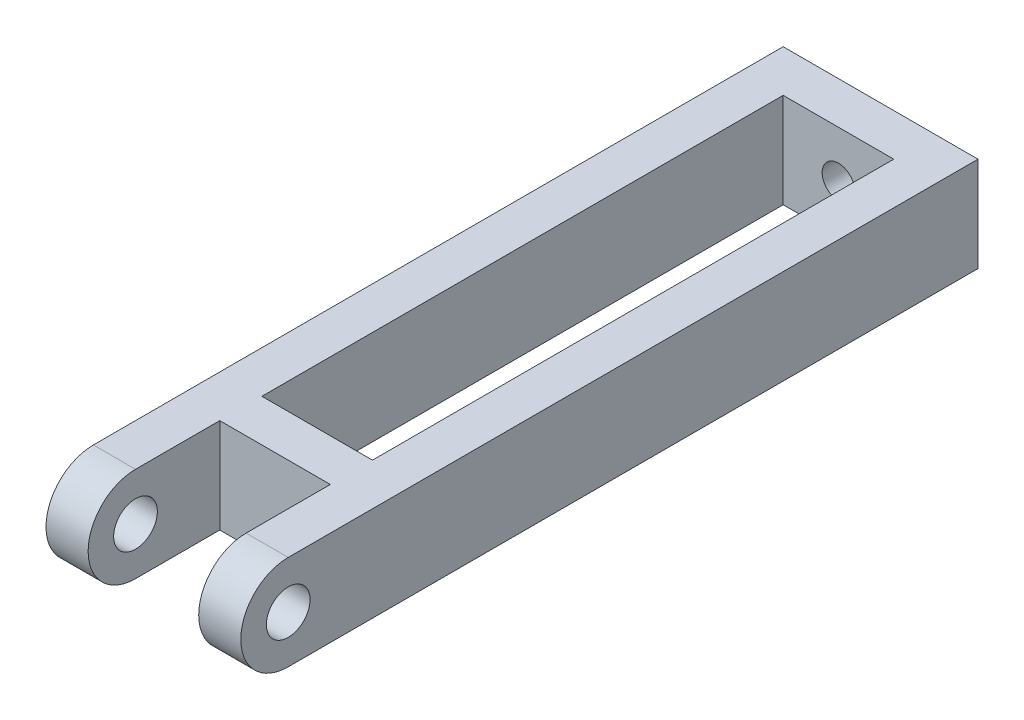
ISO-10303-21;
HEADER;
FILE_DESCRIPTION(('STEP AP214'),'2;1');
FILE_NAME('part.step','',(''),(''),'','','');
FILE_SCHEMA(('AUTOMOTIVE_DESIGN { 1 0 10303 214 1 1 1 1 }'));
ENDSEC;
DATA;
#1=APPLICATION_CONTEXT('core data for automotive mechanical design processes');
#2=APPLICATION_PROTOCOL_DEFINITION('international standard','automotive_design',2000,#1);
#3=PRODUCT_CONTEXT('',#1,'mechanical');
#4=PRODUCT('Part','Part','',(#3));
#5=PRODUCT_RELATED_PRODUCT_CATEGORY('part','',(#4));
#6=PRODUCT_DEFINITION_FORMATION('','',#4);
#7=PRODUCT_DEFINITION_CONTEXT('part definition',#1,'design');
#8=PRODUCT_DEFINITION('design','',#6,#7);
#9=PRODUCT_DEFINITION_SHAPE('','',#8);
#10=(LENGTH_UNIT() NAMED_UNIT(*) SI_UNIT(.MILLI.,.METRE.));
#11=(NAMED_UNIT(*) PLANE_ANGLE_UNIT() SI_UNIT($,.RADIAN.));
#12=(NAMED_UNIT(*) SI_UNIT($,.STERADIAN.) SOLID_ANGLE_UNIT());
#13=UNCERTAINTY_MEASURE_WITH_UNIT(LENGTH_MEASURE(1.E-05),#10,'distance_accuracy_value','');
#14=(GEOMETRIC_REPRESENTATION_CONTEXT(3) GLOBAL_UNCERTAINTY_ASSIGNED_CONTEXT((#13)) GLOBAL_UNIT_ASSIGNED_CONTEXT((#10,
#11,#12)) REPRESENTATION_CONTEXT('',''));
#15=CARTESIAN_POINT('',(0.,0.,0.));
#16=DIRECTION('',(0.,0.,1.));
#17=DIRECTION('',(1.,0.,0.));
#18=AXIS2_PLACEMENT_3D('',#15,#16,#17);
#19=CARTESIAN_POINT('',(-4.,4.5,0.));
#20=DIRECTION('',(0.,1.,0.));
#21=DIRECTION('',(0.,0.,1.));
#22=AXIS2_PLACEMENT_3D('',#19,#20,#21);
#23=PLANE('',#22);
#24=DIRECTION('',(0.,0.,1.));
#25=VECTOR('',#24,1.);
#26=CARTESIAN_POINT('',(0.,4.5,0.));
#27=LINE('',#26,#25);
#28=CARTESIAN_POINT('',(0.,4.5,-8.));
#29=VERTEX_POINT('',#28);
#30=CARTESIAN_POINT('',(0.,4.5,0.));
#31=VERTEX_POINT('',#30);
#32=EDGE_CURVE('E160',#29,#31,#27,.T.);
#33=ORIENTED_EDGE('',*,*,#32,.F.);
#34=DIRECTION('',(-1.,0.,0.));
#35=VECTOR('',#34,1.);
#36=CARTESIAN_POINT('',(5.25,4.5,-8.));
#37=LINE('',#36,#35);
#38=CARTESIAN_POINT('',(10.5,4.5,-8.));
#39=VERTEX_POINT('',#38);
#40=EDGE_CURVE('E187',#39,#29,#37,.T.);
#41=ORIENTED_EDGE('',*,*,#40,.F.);
#42=DIRECTION('',(0.,0.,1.));
#43=VECTOR('',#42,1.);
#44=CARTESIAN_POINT('',(10.5,4.5,0.));
#45=LINE('',#44,#43);
#46=CARTESIAN_POINT('',(10.5,4.5,0.));
#47=VERTEX_POINT('',#46);
#48=EDGE_CURVE('E200',#39,#47,#45,.T.);
#49=ORIENTED_EDGE('',*,*,#48,.T.);
#50=DIRECTION('',(-1.,0.,0.));
#51=VECTOR('',#50,1.);
#52=CARTESIAN_POINT('',(14.5,4.5,0.));
#53=LINE('',#52,#51);
#54=CARTESIAN_POINT('',(14.5,4.5,0.));
#55=VERTEX_POINT('',#54);
#56=EDGE_CURVE('E193',#55,#47,#53,.T.);
#57=ORIENTED_EDGE('',*,*,#56,.F.);
#58=DIRECTION('',(0.,0.,1.));
#59=VECTOR('',#58,1.);
#60=CARTESIAN_POINT('',(14.5,4.5,0.));
#61=LINE('',#60,#59);
#62=CARTESIAN_POINT('',(14.5,4.5,-65.5));
#63=VERTEX_POINT('',#62);
#64=EDGE_CURVE('E197',#63,#55,#61,.T.);
#65=ORIENTED_EDGE('',*,*,#64,.F.);
#66=DIRECTION('',(1.,0.,0.));
#67=VECTOR('',#66,1.);
#68=CARTESIAN_POINT('',(-4.,4.5,-65.5));
#69=LINE('',#68,#67);
#70=CARTESIAN_POINT('',(-4.,4.5,-65.5));
#71=VERTEX_POINT('',#70);
#72=EDGE_CURVE('E156',#71,#63,#69,.T.);
#73=ORIENTED_EDGE('',*,*,#72,.F.);
#74=DIRECTION('',(0.,0.,1.));
#75=VECTOR('',#74,1.);
#76=CARTESIAN_POINT('',(-4.,4.5,0.));
#77=LINE('',#76,#75);
#78=CARTESIAN_POINT('',(-4.,4.5,0.));
#79=VERTEX_POINT('',#78);
#80=EDGE_CURVE('E154',#71,#79,#77,.T.);
#81=ORIENTED_EDGE('',*,*,#80,.T.);
#82=DIRECTION('',(1.,0.,0.));
#83=VECTOR('',#82,1.);
#84=CARTESIAN_POINT('',(-4.,4.5,0.));
#85=LINE('',#84,#83);
#86=EDGE_CURVE('E135',#79,#31,#85,.T.);
#87=ORIENTED_EDGE('',*,*,#86,.T.);
#88=EDGE_LOOP('',(#33,#41,#49,#57,#65,#73,#81,#87));
#89=FACE_BOUND('',#88,.T.);
#90=DIRECTION('',(-1.,0.,0.));
#91=VECTOR('',#90,1.);
#92=CARTESIAN_POINT('',(-4.,4.5,-12.));
#93=LINE('',#92,#91);
#94=CARTESIAN_POINT('',(10.5,4.5,-12.));
#95=VERTEX_POINT('',#94);
#96=CARTESIAN_POINT('',(0.,4.5,-12.));
#97=VERTEX_POINT('',#96);
#98=EDGE_CURVE('E230',#95,#97,#93,.T.);
#99=ORIENTED_EDGE('',*,*,#98,.T.);
#100=DIRECTION('',(0.,0.,-1.));
#101=VECTOR('',#100,1.);
#102=CARTESIAN_POINT('',(0.,4.5,0.));
#103=LINE('',#102,#101);
#104=CARTESIAN_POINT('',(0.,4.5,-61.5));
#105=VERTEX_POINT('',#104);
#106=EDGE_CURVE('E227',#97,#105,#103,.T.);
#107=ORIENTED_EDGE('',*,*,#106,.T.);
#108=DIRECTION('',(1.,0.,0.));
#109=VECTOR('',#108,1.);
#110=CARTESIAN_POINT('',(-4.,4.5,-61.5));
#111=LINE('',#110,#109);
#112=CARTESIAN_POINT('',(10.5,4.5,-61.5));
#113=VERTEX_POINT('',#112);
#114=EDGE_CURVE('E234',#105,#113,#111,.T.);
#115=ORIENTED_EDGE('',*,*,#114,.T.);
#116=DIRECTION('',(0.,0.,1.));
#117=VECTOR('',#116,1.);
#118=CARTESIAN_POINT('',(10.5,4.5,0.));
#119=LINE('',#118,#117);
#120=EDGE_CURVE('E142',#113,#95,#119,.T.);
#121=ORIENTED_EDGE('',*,*,#120,.T.);
#122=EDGE_LOOP('',(#99,#107,#115,#121));
#123=FACE_BOUND('',#122,.T.);
#124=ADVANCED_FACE('F43',(#89,#123),#23,.T.);
#125=CARTESIAN_POINT('',(-4.,-4.5,0.));
#126=DIRECTION('',(0.,-1.,0.));
#127=DIRECTION('',(0.,0.,-1.));
#128=AXIS2_PLACEMENT_3D('',#125,#126,#127);
#129=PLANE('',#128);
#130=DIRECTION('',(0.,0.,-1.));
#131=VECTOR('',#130,1.);
#132=CARTESIAN_POINT('',(0.,-4.5,0.));
#133=LINE('',#132,#131);
#134=CARTESIAN_POINT('',(0.,-4.5,0.));
#135=VERTEX_POINT('',#134);
#136=CARTESIAN_POINT('',(0.,-4.5,-8.));
#137=VERTEX_POINT('',#136);
#138=EDGE_CURVE('E163',#135,#137,#133,.T.);
#139=ORIENTED_EDGE('',*,*,#138,.F.);
#140=DIRECTION('',(1.,0.,0.));
#141=VECTOR('',#140,1.);
#142=CARTESIAN_POINT('',(-4.,-4.5,0.));
#143=LINE('',#142,#141);
#144=CARTESIAN_POINT('',(-4.,-4.5,0.));
#145=VERTEX_POINT('',#144);
#146=EDGE_CURVE('E151',#145,#135,#143,.T.);
#147=ORIENTED_EDGE('',*,*,#146,.F.);
#148=DIRECTION('',(0.,0.,-1.));
#149=VECTOR('',#148,1.);
#150=CARTESIAN_POINT('',(-4.,-4.5,0.));
#151=LINE('',#150,#149);
#152=CARTESIAN_POINT('',(-4.,-4.5,-65.5));
#153=VERTEX_POINT('',#152);
#154=EDGE_CURVE('E174',#145,#153,#151,.T.);
#155=ORIENTED_EDGE('',*,*,#154,.T.);
#156=DIRECTION('',(1.,0.,0.));
#157=VECTOR('',#156,1.);
#158=CARTESIAN_POINT('',(-4.,-4.5,-65.5));
#159=LINE('',#158,#157);
#160=CARTESIAN_POINT('',(14.5,-4.5,-65.5));
#161=VERTEX_POINT('',#160);
#162=EDGE_CURVE('E153',#153,#161,#159,.T.);
#163=ORIENTED_EDGE('',*,*,#162,.T.);
#164=DIRECTION('',(0.,0.,-1.));
#165=VECTOR('',#164,1.);
#166=CARTESIAN_POINT('',(14.5,-4.5,0.));
#167=LINE('',#166,#165);
#168=CARTESIAN_POINT('',(14.5,-4.5,0.));
#169=VERTEX_POINT('',#168);
#170=EDGE_CURVE('E214',#169,#161,#167,.T.);
#171=ORIENTED_EDGE('',*,*,#170,.F.);
#172=DIRECTION('',(-1.,0.,0.));
#173=VECTOR('',#172,1.);
#174=CARTESIAN_POINT('',(14.5,-4.5,0.));
#175=LINE('',#174,#173);
#176=CARTESIAN_POINT('',(10.5,-4.5,0.));
#177=VERTEX_POINT('',#176);
#178=EDGE_CURVE('E194',#169,#177,#175,.T.);
#179=ORIENTED_EDGE('',*,*,#178,.T.);
#180=DIRECTION('',(0.,0.,-1.));
#181=VECTOR('',#180,1.);
#182=CARTESIAN_POINT('',(10.5,-4.5,0.));
#183=LINE('',#182,#181);
#184=CARTESIAN_POINT('',(10.5,-4.5,-8.));
#185=VERTEX_POINT('',#184);
#186=EDGE_CURVE('E203',#177,#185,#183,.T.);
#187=ORIENTED_EDGE('',*,*,#186,.T.);
#188=DIRECTION('',(-1.,0.,0.));
#189=VECTOR('',#188,1.);
#190=CARTESIAN_POINT('',(5.25,-4.5,-8.));
#191=LINE('',#190,#189);
#192=EDGE_CURVE('E182',#185,#137,#191,.T.);
#193=ORIENTED_EDGE('',*,*,#192,.T.);
#194=EDGE_LOOP('',(#139,#147,#155,#163,#171,#179,#187,#193));
#195=FACE_BOUND('',#194,.T.);
#196=DIRECTION('',(-1.,0.,0.));
#197=VECTOR('',#196,1.);
#198=CARTESIAN_POINT('',(-4.,-4.5,-61.5));
#199=LINE('',#198,#197);
#200=CARTESIAN_POINT('',(10.5,-4.5,-61.5));
#201=VERTEX_POINT('',#200);
#202=CARTESIAN_POINT('',(0.,-4.5,-61.5));
#203=VERTEX_POINT('',#202);
#204=EDGE_CURVE('E130',#201,#203,#199,.T.);
#205=ORIENTED_EDGE('',*,*,#204,.T.);
#206=DIRECTION('',(0.,0.,1.));
#207=VECTOR('',#206,1.);
#208=CARTESIAN_POINT('',(0.,-4.5,0.));
#209=LINE('',#208,#207);
#210=CARTESIAN_POINT('',(0.,-4.5,-12.));
#211=VERTEX_POINT('',#210);
#212=EDGE_CURVE('E11',#203,#211,#209,.T.);
#213=ORIENTED_EDGE('',*,*,#212,.T.);
#214=DIRECTION('',(1.,0.,0.));
#215=VECTOR('',#214,1.);
#216=CARTESIAN_POINT('',(-4.,-4.5,-12.));
#217=LINE('',#216,#215);
#218=CARTESIAN_POINT('',(10.5,-4.5,-12.));
#219=VERTEX_POINT('',#218);
#220=EDGE_CURVE('E52',#211,#219,#217,.T.);
#221=ORIENTED_EDGE('',*,*,#220,.T.);
#222=DIRECTION('',(0.,0.,-1.));
#223=VECTOR('',#222,1.);
#224=CARTESIAN_POINT('',(10.5,-4.5,0.));
#225=LINE('',#224,#223);
#226=EDGE_CURVE('E134',#219,#201,#225,.T.);
#227=ORIENTED_EDGE('',*,*,#226,.T.);
#228=EDGE_LOOP('',(#205,#213,#221,#227));
#229=FACE_BOUND('',#228,.T.);
#230=ADVANCED_FACE('F147',(#195,#229),#129,.T.);
#231=CARTESIAN_POINT('',(-4.,0.,0.));
#232=DIRECTION('',(1.,0.,0.));
#233=DIRECTION('',(0.,0.,-1.));
#234=AXIS2_PLACEMENT_3D('',#231,#232,#233);
#235=CYLINDRICAL_SURFACE('',#234,4.5);
#236=CARTESIAN_POINT('',(0.,0.,0.));
#237=DIRECTION('',(1.,0.,0.));
#238=DIRECTION('',(0.,0.,-1.));
#239=AXIS2_PLACEMENT_3D('',#236,#237,#238);
#240=CIRCLE('',#239,4.5);
#241=EDGE_CURVE('E165',#31,#135,#240,.T.);
#242=ORIENTED_EDGE('',*,*,#241,.F.);
#243=ORIENTED_EDGE('',*,*,#86,.F.);
#244=CARTESIAN_POINT('',(-4.,0.,0.));
#245=DIRECTION('',(1.,0.,0.));
#246=DIRECTION('',(0.,0.,-1.));
#247=AXIS2_PLACEMENT_3D('',#244,#245,#246);
#248=CIRCLE('',#247,4.5);
#249=EDGE_CURVE('E162',#79,#145,#248,.T.);
#250=ORIENTED_EDGE('',*,*,#249,.T.);
#251=ORIENTED_EDGE('',*,*,#146,.T.);
#252=EDGE_LOOP('',(#242,#243,#250,#251));
#253=FACE_BOUND('',#252,.T.);
#254=ADVANCED_FACE('F45',(#253),#235,.T.);
#255=CARTESIAN_POINT('',(-4.,4.5,-65.5));
#256=DIRECTION('',(0.,0.,-1.));
#257=DIRECTION('',(-1.,0.,0.));
#258=AXIS2_PLACEMENT_3D('',#255,#256,#257);
#259=PLANE('',#258);
#260=CARTESIAN_POINT('',(5.25,0.,-65.5));
#261=DIRECTION('',(0.,0.,-1.));
#262=DIRECTION('',(-1.,0.,0.));
#263=AXIS2_PLACEMENT_3D('',#260,#261,#262);
#264=CIRCLE('',#263,1.55);
#265=CARTESIAN_POINT('',(3.7,0.,-65.5));
#266=VERTEX_POINT('',#265);
#267=EDGE_CURVE('E241',#266,#266,#264,.T.);
#268=ORIENTED_EDGE('',*,*,#267,.F.);
#269=EDGE_LOOP('',(#268));
#270=FACE_BOUND('',#269,.T.);
#271=ORIENTED_EDGE('',*,*,#72,.T.);
#272=DIRECTION('',(0.,1.,0.));
#273=VECTOR('',#272,1.);
#274=CARTESIAN_POINT('',(14.5,4.5,-65.5));
#275=LINE('',#274,#273);
#276=EDGE_CURVE('E211',#161,#63,#275,.T.);
#277=ORIENTED_EDGE('',*,*,#276,.F.);
#278=ORIENTED_EDGE('',*,*,#162,.F.);
#279=DIRECTION('',(0.,1.,0.));
#280=VECTOR('',#279,1.);
#281=CARTESIAN_POINT('',(-4.,4.5,-65.5));
#282=LINE('',#281,#280);
#283=EDGE_CURVE('E171',#153,#71,#282,.T.);
#284=ORIENTED_EDGE('',*,*,#283,.T.);
#285=EDGE_LOOP('',(#271,#277,#278,#284));
#286=FACE_BOUND('',#285,.T.);
#287=ADVANCED_FACE('F274',(#270,#286),#259,.T.);
#288=CARTESIAN_POINT('',(-4.,0.,0.));
#289=DIRECTION('',(1.,0.,0.));
#290=DIRECTION('',(0.,0.,-1.));
#291=AXIS2_PLACEMENT_3D('',#288,#289,#290);
#292=PLANE('',#291);
#293=CARTESIAN_POINT('',(-4.,0.,0.));
#294=DIRECTION('',(1.,0.,0.));
#295=DIRECTION('',(0.,0.,-1.));
#296=AXIS2_PLACEMENT_3D('',#293,#294,#295);
#297=CIRCLE('',#296,2.075);
#298=CARTESIAN_POINT('',(-4.,0.,-2.075));
#299=VERTEX_POINT('',#298);
#300=EDGE_CURVE('E168',#299,#299,#297,.T.);
#301=ORIENTED_EDGE('',*,*,#300,.T.);
#302=EDGE_LOOP('',(#301));
#303=FACE_BOUND('',#302,.T.);
#304=ORIENTED_EDGE('',*,*,#249,.F.);
#305=ORIENTED_EDGE('',*,*,#80,.F.);
#306=ORIENTED_EDGE('',*,*,#283,.F.);
#307=ORIENTED_EDGE('',*,*,#154,.F.);
#308=EDGE_LOOP('',(#304,#305,#306,#307));
#309=FACE_BOUND('',#308,.T.);
#310=ADVANCED_FACE('F275',(#303,#309),#292,.F.);
#311=CARTESIAN_POINT('',(0.,0.,0.));
#312=DIRECTION('',(1.,0.,0.));
#313=DIRECTION('',(0.,0.,-1.));
#314=AXIS2_PLACEMENT_3D('',#311,#312,#313);
#315=PLANE('',#314);
#316=DIRECTION('',(0.,-1.,0.));
#317=VECTOR('',#316,1.);
#318=CARTESIAN_POINT('',(0.,4.5,-8.));
#319=LINE('',#318,#317);
#320=EDGE_CURVE('E190',#29,#137,#319,.T.);
#321=ORIENTED_EDGE('',*,*,#320,.F.);
#322=ORIENTED_EDGE('',*,*,#32,.T.);
#323=ORIENTED_EDGE('',*,*,#241,.T.);
#324=ORIENTED_EDGE('',*,*,#138,.T.);
#325=EDGE_LOOP('',(#321,#322,#323,#324));
#326=FACE_BOUND('',#325,.T.);
#327=CARTESIAN_POINT('',(0.,0.,0.));
#328=DIRECTION('',(1.,0.,0.));
#329=DIRECTION('',(0.,0.,-1.));
#330=AXIS2_PLACEMENT_3D('',#327,#328,#329);
#331=CIRCLE('',#330,2.075);
#332=CARTESIAN_POINT('',(0.,0.,-2.075));
#333=VERTEX_POINT('',#332);
#334=EDGE_CURVE('E179',#333,#333,#331,.T.);
#335=ORIENTED_EDGE('',*,*,#334,.F.);
#336=EDGE_LOOP('',(#335));
#337=FACE_BOUND('',#336,.T.);
#338=ADVANCED_FACE('F272',(#326,#337),#315,.T.);
#339=CARTESIAN_POINT('',(-4.,0.,0.));
#340=DIRECTION('',(1.,0.,0.));
#341=DIRECTION('',(0.,0.,-1.));
#342=AXIS2_PLACEMENT_3D('',#339,#340,#341);
#343=CYLINDRICAL_SURFACE('',#342,2.075);
#344=ORIENTED_EDGE('',*,*,#300,.F.);
#345=EDGE_LOOP('',(#344));
#346=FACE_BOUND('',#345,.T.);
#347=ORIENTED_EDGE('',*,*,#334,.T.);
#348=EDGE_LOOP('',(#347));
#349=FACE_BOUND('',#348,.T.);
#350=ADVANCED_FACE('F332',(#346,#349),#343,.F.);
#351=CARTESIAN_POINT('',(5.25,4.5,-8.));
#352=DIRECTION('',(0.,0.,-1.));
#353=DIRECTION('',(0.,1.,0.));
#354=AXIS2_PLACEMENT_3D('',#351,#352,#353);
#355=PLANE('',#354);
#356=ORIENTED_EDGE('',*,*,#320,.T.);
#357=ORIENTED_EDGE('',*,*,#192,.F.);
#358=DIRECTION('',(0.,-1.,0.));
#359=VECTOR('',#358,1.);
#360=CARTESIAN_POINT('',(10.5,4.5,-8.));
#361=LINE('',#360,#359);
#362=EDGE_CURVE('E222',#39,#185,#361,.T.);
#363=ORIENTED_EDGE('',*,*,#362,.F.);
#364=ORIENTED_EDGE('',*,*,#40,.T.);
#365=EDGE_LOOP('',(#356,#357,#363,#364));
#366=FACE_BOUND('',#365,.T.);
#367=ADVANCED_FACE('F305',(#366),#355,.F.);
#368=CARTESIAN_POINT('',(14.5,0.,0.));
#369=DIRECTION('',(-1.,0.,0.));
#370=DIRECTION('',(0.,0.,-1.));
#371=AXIS2_PLACEMENT_3D('',#368,#369,#370);
#372=CYLINDRICAL_SURFACE('',#371,4.5);
#373=CARTESIAN_POINT('',(10.5,0.,0.));
#374=DIRECTION('',(1.,0.,0.));
#375=DIRECTION('',(0.,0.,-1.));
#376=AXIS2_PLACEMENT_3D('',#373,#374,#375);
#377=CIRCLE('',#376,4.5);
#378=EDGE_CURVE('E206',#47,#177,#377,.T.);
#379=ORIENTED_EDGE('',*,*,#378,.T.);
#380=ORIENTED_EDGE('',*,*,#178,.F.);
#381=CARTESIAN_POINT('',(14.5,0.,0.));
#382=DIRECTION('',(1.,0.,0.));
#383=DIRECTION('',(0.,0.,-1.));
#384=AXIS2_PLACEMENT_3D('',#381,#382,#383);
#385=CIRCLE('',#384,4.5);
#386=EDGE_CURVE('E202',#55,#169,#385,.T.);
#387=ORIENTED_EDGE('',*,*,#386,.F.);
#388=ORIENTED_EDGE('',*,*,#56,.T.);
#389=EDGE_LOOP('',(#379,#380,#387,#388));
#390=FACE_BOUND('',#389,.T.);
#391=ADVANCED_FACE('F296',(#390),#372,.T.);
#392=CARTESIAN_POINT('',(14.5,0.,0.));
#393=DIRECTION('',(-1.,0.,0.));
#394=DIRECTION('',(0.,0.,-1.));
#395=AXIS2_PLACEMENT_3D('',#392,#393,#394);
#396=PLANE('',#395);
#397=CARTESIAN_POINT('',(14.5,0.,0.));
#398=DIRECTION('',(1.,0.,0.));
#399=DIRECTION('',(0.,0.,-1.));
#400=AXIS2_PLACEMENT_3D('',#397,#398,#399);
#401=CIRCLE('',#400,2.075);
#402=CARTESIAN_POINT('',(14.5,0.,-2.075));
#403=VERTEX_POINT('',#402);
#404=EDGE_CURVE('E209',#403,#403,#401,.T.);
#405=ORIENTED_EDGE('',*,*,#404,.F.);
#406=EDGE_LOOP('',(#405));
#407=FACE_BOUND('',#406,.T.);
#408=ORIENTED_EDGE('',*,*,#386,.T.);
#409=ORIENTED_EDGE('',*,*,#170,.T.);
#410=ORIENTED_EDGE('',*,*,#276,.T.);
#411=ORIENTED_EDGE('',*,*,#64,.T.);
#412=EDGE_LOOP('',(#408,#409,#410,#411));
#413=FACE_BOUND('',#412,.T.);
#414=ADVANCED_FACE('F289',(#407,#413),#396,.F.);
#415=CARTESIAN_POINT('',(10.5,0.,0.));
#416=DIRECTION('',(-1.,0.,0.));
#417=DIRECTION('',(0.,0.,-1.));
#418=AXIS2_PLACEMENT_3D('',#415,#416,#417);
#419=PLANE('',#418);
#420=ORIENTED_EDGE('',*,*,#362,.T.);
#421=ORIENTED_EDGE('',*,*,#186,.F.);
#422=ORIENTED_EDGE('',*,*,#378,.F.);
#423=ORIENTED_EDGE('',*,*,#48,.F.);
#424=EDGE_LOOP('',(#420,#421,#422,#423));
#425=FACE_BOUND('',#424,.T.);
#426=CARTESIAN_POINT('',(10.5,0.,0.));
#427=DIRECTION('',(1.,0.,0.));
#428=DIRECTION('',(0.,0.,-1.));
#429=AXIS2_PLACEMENT_3D('',#426,#427,#428);
#430=CIRCLE('',#429,2.075);
#431=CARTESIAN_POINT('',(10.5,0.,-2.075));
#432=VERTEX_POINT('',#431);
#433=EDGE_CURVE('E219',#432,#432,#430,.T.);
#434=ORIENTED_EDGE('',*,*,#433,.T.);
#435=EDGE_LOOP('',(#434));
#436=FACE_BOUND('',#435,.T.);
#437=ADVANCED_FACE('F308',(#425,#436),#419,.T.);
#438=CARTESIAN_POINT('',(14.5,0.,0.));
#439=DIRECTION('',(-1.,0.,0.));
#440=DIRECTION('',(0.,0.,-1.));
#441=AXIS2_PLACEMENT_3D('',#438,#439,#440);
#442=CYLINDRICAL_SURFACE('',#441,2.075);
#443=ORIENTED_EDGE('',*,*,#404,.T.);
#444=EDGE_LOOP('',(#443));
#445=FACE_BOUND('',#444,.T.);
#446=ORIENTED_EDGE('',*,*,#433,.F.);
#447=EDGE_LOOP('',(#446));
#448=FACE_BOUND('',#447,.T.);
#449=ADVANCED_FACE('F311',(#445,#448),#442,.F.);
#450=CARTESIAN_POINT('',(0.,11.,-12.));
#451=DIRECTION('',(1.,0.,0.));
#452=DIRECTION('',(0.,0.,-1.));
#453=AXIS2_PLACEMENT_3D('',#450,#451,#452);
#454=PLANE('',#453);
#455=DIRECTION('',(0.,-1.,0.));
#456=VECTOR('',#455,1.);
#457=CARTESIAN_POINT('',(0.,11.,-12.));
#458=LINE('',#457,#456);
#459=EDGE_CURVE('E236',#97,#211,#458,.T.);
#460=ORIENTED_EDGE('',*,*,#459,.T.);
#461=ORIENTED_EDGE('',*,*,#212,.F.);
#462=DIRECTION('',(0.,-1.,0.));
#463=VECTOR('',#462,1.);
#464=CARTESIAN_POINT('',(0.,11.,-61.5));
#465=LINE('',#464,#463);
#466=EDGE_CURVE('E64',#105,#203,#465,.T.);
#467=ORIENTED_EDGE('',*,*,#466,.F.);
#468=ORIENTED_EDGE('',*,*,#106,.F.);
#469=EDGE_LOOP('',(#460,#461,#467,#468));
#470=FACE_BOUND('',#469,.T.);
#471=ADVANCED_FACE('F315',(#470),#454,.T.);
#472=CARTESIAN_POINT('',(0.,11.,-12.));
#473=DIRECTION('',(0.,0.,-1.));
#474=DIRECTION('',(-1.,0.,0.));
#475=AXIS2_PLACEMENT_3D('',#472,#473,#474);
#476=PLANE('',#475);
#477=DIRECTION('',(0.,-1.,0.));
#478=VECTOR('',#477,1.);
#479=CARTESIAN_POINT('',(10.5,11.,-12.));
#480=LINE('',#479,#478);
#481=EDGE_CURVE('E144',#95,#219,#480,.T.);
#482=ORIENTED_EDGE('',*,*,#481,.T.);
#483=ORIENTED_EDGE('',*,*,#220,.F.);
#484=ORIENTED_EDGE('',*,*,#459,.F.);
#485=ORIENTED_EDGE('',*,*,#98,.F.);
#486=EDGE_LOOP('',(#482,#483,#484,#485));
#487=FACE_BOUND('',#486,.T.);
#488=ADVANCED_FACE('F258',(#487),#476,.T.);
#489=CARTESIAN_POINT('',(10.5,11.,-12.));
#490=DIRECTION('',(-1.,0.,0.));
#491=DIRECTION('',(0.,0.,1.));
#492=AXIS2_PLACEMENT_3D('',#489,#490,#491);
#493=PLANE('',#492);
#494=DIRECTION('',(0.,-1.,0.));
#495=VECTOR('',#494,1.);
#496=CARTESIAN_POINT('',(10.5,11.,-61.5));
#497=LINE('',#496,#495);
#498=EDGE_CURVE('E59',#113,#201,#497,.T.);
#499=ORIENTED_EDGE('',*,*,#498,.T.);
#500=ORIENTED_EDGE('',*,*,#226,.F.);
#501=ORIENTED_EDGE('',*,*,#481,.F.);
#502=ORIENTED_EDGE('',*,*,#120,.F.);
#503=EDGE_LOOP('',(#499,#500,#501,#502));
#504=FACE_BOUND('',#503,.T.);
#505=ADVANCED_FACE('F138',(#504),#493,.T.);
#506=CARTESIAN_POINT('',(0.,11.,-61.5));
#507=DIRECTION('',(0.,0.,1.));
#508=DIRECTION('',(1.,0.,0.));
#509=AXIS2_PLACEMENT_3D('',#506,#507,#508);
#510=PLANE('',#509);
#511=CARTESIAN_POINT('',(5.25,0.,-61.5));
#512=DIRECTION('',(0.,0.,1.));
#513=DIRECTION('',(1.,0.,0.));
#514=AXIS2_PLACEMENT_3D('',#511,#512,#513);
#515=CIRCLE('',#514,1.55);
#516=CARTESIAN_POINT('',(6.8,0.,-61.5));
#517=VERTEX_POINT('',#516);
#518=EDGE_CURVE('E47',#517,#517,#515,.T.);
#519=ORIENTED_EDGE('',*,*,#518,.F.);
#520=EDGE_LOOP('',(#519));
#521=FACE_BOUND('',#520,.T.);
#522=ORIENTED_EDGE('',*,*,#466,.T.);
#523=ORIENTED_EDGE('',*,*,#204,.F.);
#524=ORIENTED_EDGE('',*,*,#498,.F.);
#525=ORIENTED_EDGE('',*,*,#114,.F.);
#526=EDGE_LOOP('',(#522,#523,#524,#525));
#527=FACE_BOUND('',#526,.T.);
#528=ADVANCED_FACE('F131',(#521,#527),#510,.T.);
#529=CARTESIAN_POINT('',(5.25,0.,-71.));
#530=DIRECTION('',(0.,0.,1.));
#531=DIRECTION('',(1.,0.,0.));
#532=AXIS2_PLACEMENT_3D('',#529,#530,#531);
#533=CYLINDRICAL_SURFACE('',#532,1.55);
#534=ORIENTED_EDGE('',*,*,#267,.T.);
#535=EDGE_LOOP('',(#534));
#536=FACE_BOUND('',#535,.T.);
#537=ORIENTED_EDGE('',*,*,#518,.T.);
#538=EDGE_LOOP('',(#537));
#539=FACE_BOUND('',#538,.T.);
#540=ADVANCED_FACE('F248',(#536,#539),#533,.F.);
#541=CLOSED_SHELL('',(#124,#230,#254,#287,#310,#338,#350,#367,#391,#414,#437,#449,#471,#488,
#505,#528,#540));
#542=MANIFOLD_SOLID_BREP('B2',#541);
#543=ADVANCED_BREP_SHAPE_REPRESENTATION('',(#18,#542),#14);
#544=SHAPE_DEFINITION_REPRESENTATION(#9,#543);
ENDSEC;
END-ISO-10303-21;
